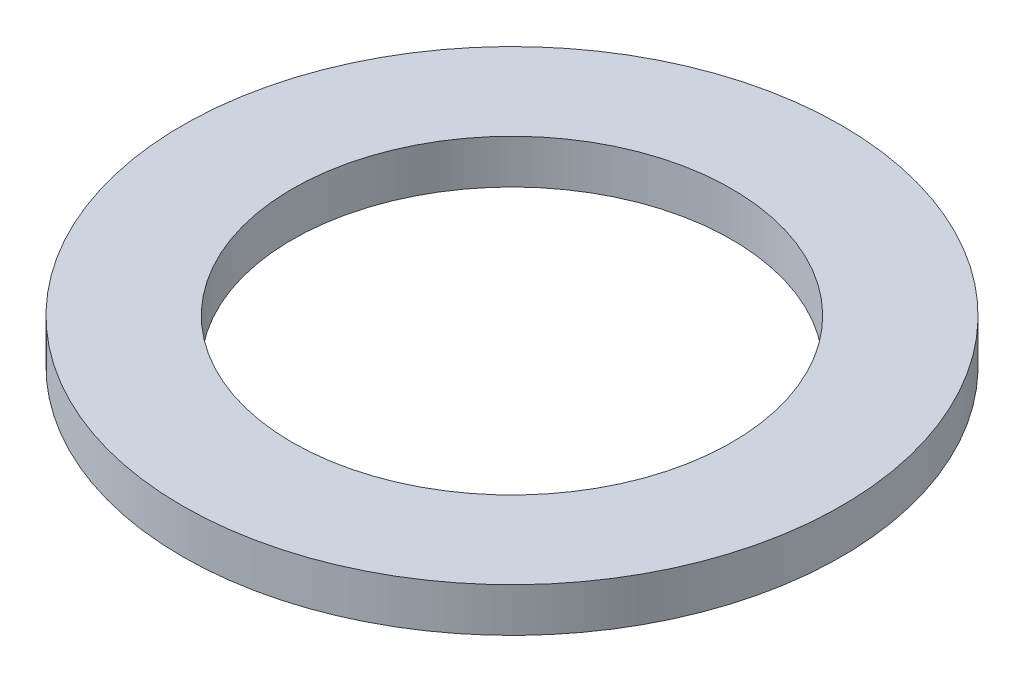
ISO-10303-21;
HEADER;
FILE_DESCRIPTION(('STEP AP214'),'2;1');
FILE_NAME('part.step','',(''),(''),'','','');
FILE_SCHEMA(('AUTOMOTIVE_DESIGN { 1 0 10303 214 1 1 1 1 }'));
ENDSEC;
DATA;
#1=APPLICATION_CONTEXT('core data for automotive mechanical design processes');
#2=APPLICATION_PROTOCOL_DEFINITION('international standard','automotive_design',2000,#1);
#3=PRODUCT_CONTEXT('',#1,'mechanical');
#4=PRODUCT('Part','Part','',(#3));
#5=PRODUCT_RELATED_PRODUCT_CATEGORY('part','',(#4));
#6=PRODUCT_DEFINITION_FORMATION('','',#4);
#7=PRODUCT_DEFINITION_CONTEXT('part definition',#1,'design');
#8=PRODUCT_DEFINITION('design','',#6,#7);
#9=PRODUCT_DEFINITION_SHAPE('','',#8);
#10=(LENGTH_UNIT() NAMED_UNIT(*) SI_UNIT(.MILLI.,.METRE.));
#11=(NAMED_UNIT(*) PLANE_ANGLE_UNIT() SI_UNIT($,.RADIAN.));
#12=(NAMED_UNIT(*) SI_UNIT($,.STERADIAN.) SOLID_ANGLE_UNIT());
#13=UNCERTAINTY_MEASURE_WITH_UNIT(LENGTH_MEASURE(1.E-05),#10,'distance_accuracy_value','');
#14=(GEOMETRIC_REPRESENTATION_CONTEXT(3) GLOBAL_UNCERTAINTY_ASSIGNED_CONTEXT((#13)) GLOBAL_UNIT_ASSIGNED_CONTEXT((#10,
#11,#12)) REPRESENTATION_CONTEXT('',''));
#15=CARTESIAN_POINT('',(0.,0.,0.));
#16=DIRECTION('',(0.,0.,1.));
#17=DIRECTION('',(1.,0.,0.));
#18=AXIS2_PLACEMENT_3D('',#15,#16,#17);
#19=CARTESIAN_POINT('',(0.,0.635,0.));
#20=DIRECTION('',(0.,-1.,0.));
#21=DIRECTION('',(0.,0.,-1.));
#22=AXIS2_PLACEMENT_3D('',#19,#20,#21);
#23=CYLINDRICAL_SURFACE('',#22,4.7625);
#24=CARTESIAN_POINT('',(0.,0.635,0.));
#25=DIRECTION('',(0.,1.,0.));
#26=DIRECTION('',(0.,0.,1.));
#27=AXIS2_PLACEMENT_3D('',#24,#25,#26);
#28=CIRCLE('',#27,4.7625);
#29=CARTESIAN_POINT('',(0.,0.635,4.7625));
#30=VERTEX_POINT('',#29);
#31=EDGE_CURVE('E10',#30,#30,#28,.T.);
#32=ORIENTED_EDGE('',*,*,#31,.F.);
#33=EDGE_LOOP('',(#32));
#34=FACE_BOUND('',#33,.T.);
#35=CARTESIAN_POINT('',(0.,0.,0.));
#36=DIRECTION('',(0.,1.,0.));
#37=DIRECTION('',(0.,0.,1.));
#38=AXIS2_PLACEMENT_3D('',#35,#36,#37);
#39=CIRCLE('',#38,4.7625);
#40=CARTESIAN_POINT('',(0.,0.,4.7625));
#41=VERTEX_POINT('',#40);
#42=EDGE_CURVE('E33',#41,#41,#39,.T.);
#43=ORIENTED_EDGE('',*,*,#42,.T.);
#44=EDGE_LOOP('',(#43));
#45=FACE_BOUND('',#44,.T.);
#46=ADVANCED_FACE('F30',(#34,#45),#23,.T.);
#47=CARTESIAN_POINT('',(0.,0.635,0.));
#48=DIRECTION('',(0.,1.,0.));
#49=DIRECTION('',(0.,0.,1.));
#50=AXIS2_PLACEMENT_3D('',#47,#48,#49);
#51=PLANE('',#50);
#52=CARTESIAN_POINT('',(0.,0.635,0.));
#53=DIRECTION('',(0.,1.,0.));
#54=DIRECTION('',(0.,0.,1.));
#55=AXIS2_PLACEMENT_3D('',#52,#53,#54);
#56=CIRCLE('',#55,3.175);
#57=CARTESIAN_POINT('',(0.,0.635,3.175));
#58=VERTEX_POINT('',#57);
#59=EDGE_CURVE('E42',#58,#58,#56,.T.);
#60=ORIENTED_EDGE('',*,*,#59,.F.);
#61=EDGE_LOOP('',(#60));
#62=FACE_BOUND('',#61,.T.);
#63=ORIENTED_EDGE('',*,*,#31,.T.);
#64=EDGE_LOOP('',(#63));
#65=FACE_BOUND('',#64,.T.);
#66=ADVANCED_FACE('F57',(#62,#65),#51,.T.);
#67=CARTESIAN_POINT('',(0.,0.,0.));
#68=DIRECTION('',(0.,1.,0.));
#69=DIRECTION('',(0.,0.,1.));
#70=AXIS2_PLACEMENT_3D('',#67,#68,#69);
#71=PLANE('',#70);
#72=CARTESIAN_POINT('',(0.,0.,0.));
#73=DIRECTION('',(0.,1.,0.));
#74=DIRECTION('',(0.,0.,1.));
#75=AXIS2_PLACEMENT_3D('',#72,#73,#74);
#76=CIRCLE('',#75,3.175);
#77=CARTESIAN_POINT('',(0.,0.,3.175));
#78=VERTEX_POINT('',#77);
#79=EDGE_CURVE('E40',#78,#78,#76,.T.);
#80=ORIENTED_EDGE('',*,*,#79,.T.);
#81=EDGE_LOOP('',(#80));
#82=FACE_BOUND('',#81,.T.);
#83=ORIENTED_EDGE('',*,*,#42,.F.);
#84=EDGE_LOOP('',(#83));
#85=FACE_BOUND('',#84,.T.);
#86=ADVANCED_FACE('F48',(#82,#85),#71,.F.);
#87=CARTESIAN_POINT('',(0.,0.,0.));
#88=DIRECTION('',(0.,1.,0.));
#89=DIRECTION('',(0.,0.,1.));
#90=AXIS2_PLACEMENT_3D('',#87,#88,#89);
#91=CYLINDRICAL_SURFACE('',#90,3.175);
#92=ORIENTED_EDGE('',*,*,#79,.F.);
#93=EDGE_LOOP('',(#92));
#94=FACE_BOUND('',#93,.T.);
#95=ORIENTED_EDGE('',*,*,#59,.T.);
#96=EDGE_LOOP('',(#95));
#97=FACE_BOUND('',#96,.T.);
#98=ADVANCED_FACE('F51',(#94,#97),#91,.F.);
#99=CLOSED_SHELL('',(#46,#66,#86,#98));
#100=MANIFOLD_SOLID_BREP('B2',#99);
#101=ADVANCED_BREP_SHAPE_REPRESENTATION('',(#18,#100),#14);
#102=SHAPE_DEFINITION_REPRESENTATION(#9,#101);
ENDSEC;
END-ISO-10303-21;
